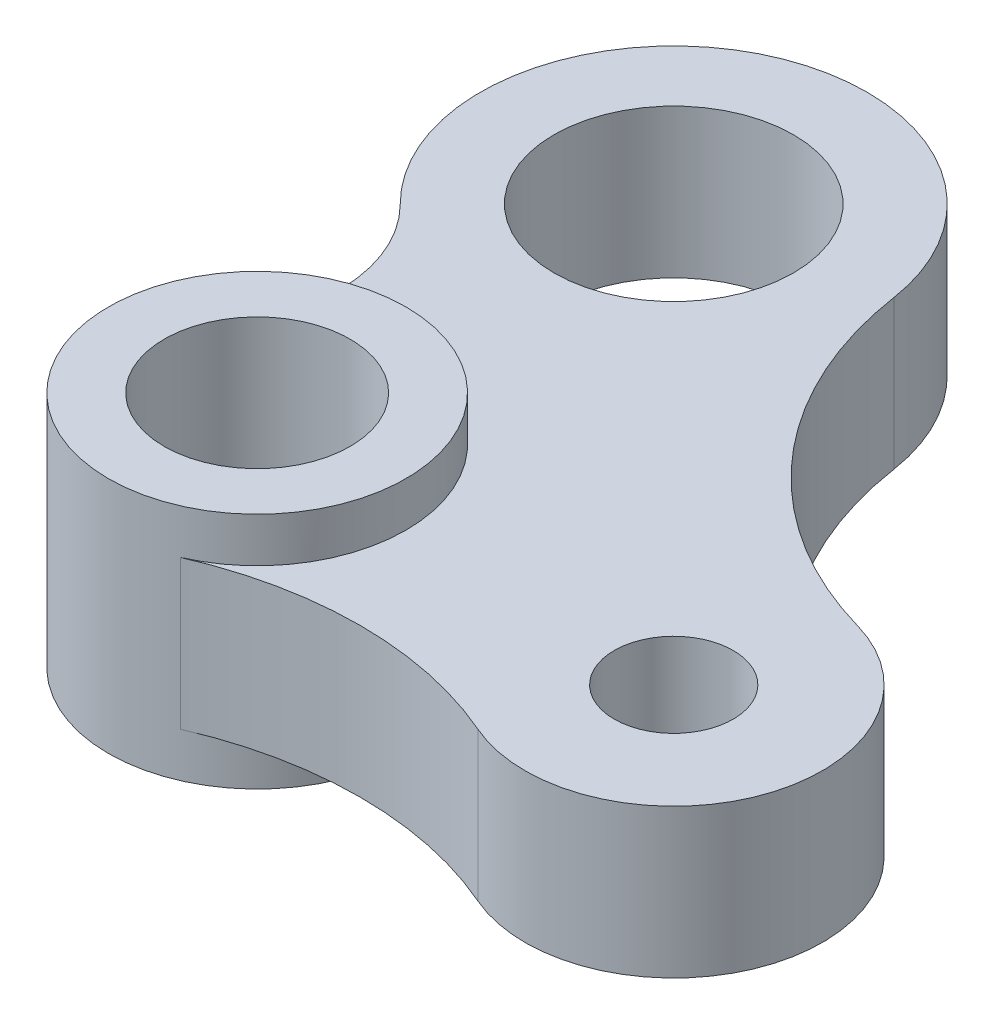
ISO-10303-21;
HEADER;
FILE_DESCRIPTION(('STEP AP214'),'2;1');
FILE_NAME('part.step','',(''),(''),'','','');
FILE_SCHEMA(('AUTOMOTIVE_DESIGN { 1 0 10303 214 1 1 1 1 }'));
ENDSEC;
DATA;
#1=APPLICATION_CONTEXT('core data for automotive mechanical design processes');
#2=APPLICATION_PROTOCOL_DEFINITION('international standard','automotive_design',2000,#1);
#3=PRODUCT_CONTEXT('',#1,'mechanical');
#4=PRODUCT('Part','Part','',(#3));
#5=PRODUCT_RELATED_PRODUCT_CATEGORY('part','',(#4));
#6=PRODUCT_DEFINITION_FORMATION('','',#4);
#7=PRODUCT_DEFINITION_CONTEXT('part definition',#1,'design');
#8=PRODUCT_DEFINITION('design','',#6,#7);
#9=PRODUCT_DEFINITION_SHAPE('','',#8);
#10=(LENGTH_UNIT() NAMED_UNIT(*) SI_UNIT(.MILLI.,.METRE.));
#11=(NAMED_UNIT(*) PLANE_ANGLE_UNIT() SI_UNIT($,.RADIAN.));
#12=(NAMED_UNIT(*) SI_UNIT($,.STERADIAN.) SOLID_ANGLE_UNIT());
#13=UNCERTAINTY_MEASURE_WITH_UNIT(LENGTH_MEASURE(1.E-05),#10,'distance_accuracy_value','');
#14=(GEOMETRIC_REPRESENTATION_CONTEXT(3) GLOBAL_UNCERTAINTY_ASSIGNED_CONTEXT((#13)) GLOBAL_UNIT_ASSIGNED_CONTEXT((#10,
#11,#12)) REPRESENTATION_CONTEXT('',''));
#15=CARTESIAN_POINT('',(0.,0.,0.));
#16=DIRECTION('',(0.,0.,1.));
#17=DIRECTION('',(1.,0.,0.));
#18=AXIS2_PLACEMENT_3D('',#15,#16,#17);
#19=CARTESIAN_POINT('',(-16.2232413121876,10.,-11.6964285714286));
#20=DIRECTION('',(0.,-1.,0.));
#21=DIRECTION('',(0.,0.,-1.));
#22=AXIS2_PLACEMENT_3D('',#19,#20,#21);
#23=CYLINDRICAL_SURFACE('',#22,10.);
#24=CARTESIAN_POINT('',(-16.2232413121876,0.,-11.6964285714286));
#25=DIRECTION('',(0.,-1.,0.));
#26=DIRECTION('',(0.,0.,1.));
#27=AXIS2_PLACEMENT_3D('',#24,#25,#26);
#28=CIRCLE('',#27,10.);
#29=CARTESIAN_POINT('',(-9.16965813297559,0.,-18.7849378881988));
#30=VERTEX_POINT('',#29);
#31=CARTESIAN_POINT('',(-8.11162065609378,0.,-5.84821428571428));
#32=VERTEX_POINT('',#31);
#33=EDGE_CURVE('E119',#30,#32,#28,.T.);
#34=ORIENTED_EDGE('',*,*,#33,.T.);
#35=DIRECTION('',(0.,-1.,0.));
#36=VECTOR('',#35,1.);
#37=CARTESIAN_POINT('',(-8.11162065609378,10.,-5.84821428571428));
#38=LINE('',#37,#36);
#39=CARTESIAN_POINT('',(-8.11162065609378,10.,-5.84821428571428));
#40=VERTEX_POINT('',#39);
#41=EDGE_CURVE('E39',#40,#32,#38,.T.);
#42=ORIENTED_EDGE('',*,*,#41,.F.);
#43=CARTESIAN_POINT('',(-16.2232413121876,10.,-11.6964285714286));
#44=DIRECTION('',(0.,-1.,0.));
#45=DIRECTION('',(0.,0.,1.));
#46=AXIS2_PLACEMENT_3D('',#43,#44,#45);
#47=CIRCLE('',#46,10.);
#48=CARTESIAN_POINT('',(-9.16965813297559,10.,-18.7849378881988));
#49=VERTEX_POINT('',#48);
#50=EDGE_CURVE('E86',#49,#40,#47,.T.);
#51=ORIENTED_EDGE('',*,*,#50,.F.);
#52=DIRECTION('',(0.,-1.,0.));
#53=VECTOR('',#52,1.);
#54=CARTESIAN_POINT('',(-9.16965813297559,10.,-18.7849378881988));
#55=LINE('',#54,#53);
#56=EDGE_CURVE('E115',#49,#30,#55,.T.);
#57=ORIENTED_EDGE('',*,*,#56,.T.);
#58=EDGE_LOOP('',(#34,#42,#51,#57));
#59=FACE_BOUND('',#58,.T.);
#60=ADVANCED_FACE('F36',(#59),#23,.F.);
#61=CARTESIAN_POINT('',(0.,10.,0.));
#62=DIRECTION('',(0.,-1.,0.));
#63=DIRECTION('',(0.,0.,-1.));
#64=AXIS2_PLACEMENT_3D('',#61,#62,#63);
#65=CYLINDRICAL_SURFACE('',#64,10.);
#66=ORIENTED_EDGE('',*,*,#41,.T.);
#67=CARTESIAN_POINT('',(0.,0.,0.));
#68=DIRECTION('',(0.,-1.,0.));
#69=DIRECTION('',(0.,0.,-1.));
#70=AXIS2_PLACEMENT_3D('',#67,#68,#69);
#71=CIRCLE('',#70,10.);
#72=CARTESIAN_POINT('',(4.,0.,9.16515138991168));
#73=VERTEX_POINT('',#72);
#74=EDGE_CURVE('E11',#32,#73,#71,.T.);
#75=ORIENTED_EDGE('',*,*,#74,.T.);
#76=DIRECTION('',(0.,-1.,0.));
#77=VECTOR('',#76,1.);
#78=CARTESIAN_POINT('',(4.00000000000001,10.,9.16515138991168));
#79=LINE('',#78,#77);
#80=CARTESIAN_POINT('',(4.00000000000001,10.,9.16515138991168));
#81=VERTEX_POINT('',#80);
#82=EDGE_CURVE('E130',#81,#73,#79,.T.);
#83=ORIENTED_EDGE('',*,*,#82,.F.);
#84=CARTESIAN_POINT('',(0.,10.,0.));
#85=DIRECTION('',(0.,1.,0.));
#86=DIRECTION('',(0.,0.,1.));
#87=AXIS2_PLACEMENT_3D('',#84,#85,#86);
#88=CIRCLE('',#87,10.);
#89=EDGE_CURVE('E140',#81,#40,#88,.T.);
#90=ORIENTED_EDGE('',*,*,#89,.T.);
#91=EDGE_LOOP('',(#66,#75,#83,#90));
#92=FACE_BOUND('',#91,.T.);
#93=CARTESIAN_POINT('',(0.,13.,0.));
#94=DIRECTION('',(0.,1.,0.));
#95=DIRECTION('',(0.,0.,1.));
#96=AXIS2_PLACEMENT_3D('',#93,#94,#95);
#97=CIRCLE('',#96,10.);
#98=CARTESIAN_POINT('',(0.,13.,10.));
#99=VERTEX_POINT('',#98);
#100=EDGE_CURVE('E148',#99,#99,#97,.T.);
#101=ORIENTED_EDGE('',*,*,#100,.F.);
#102=EDGE_LOOP('',(#101));
#103=FACE_BOUND('',#102,.T.);
#104=CARTESIAN_POINT('',(0.,-3.,0.));
#105=DIRECTION('',(0.,-1.,0.));
#106=DIRECTION('',(0.,0.,-1.));
#107=AXIS2_PLACEMENT_3D('',#104,#105,#106);
#108=CIRCLE('',#107,10.);
#109=CARTESIAN_POINT('',(0.,-3.,-10.));
#110=VERTEX_POINT('',#109);
#111=EDGE_CURVE('E149',#110,#110,#108,.T.);
#112=ORIENTED_EDGE('',*,*,#111,.F.);
#113=EDGE_LOOP('',(#112));
#114=FACE_BOUND('',#113,.T.);
#115=ADVANCED_FACE('F138',(#92,#103,#114),#65,.T.);
#116=CARTESIAN_POINT('',(14.,10.,32.0780298646909));
#117=DIRECTION('',(0.,-1.,0.));
#118=DIRECTION('',(0.,0.,-1.));
#119=AXIS2_PLACEMENT_3D('',#116,#117,#118);
#120=CYLINDRICAL_SURFACE('',#119,25.);
#121=CARTESIAN_POINT('',(14.,0.,32.0780298646909));
#122=DIRECTION('',(0.,-1.,0.));
#123=DIRECTION('',(0.,0.,1.));
#124=AXIS2_PLACEMENT_3D('',#121,#122,#123);
#125=CIRCLE('',#124,25.);
#126=CARTESIAN_POINT('',(24.,0.,9.16515138991168));
#127=VERTEX_POINT('',#126);
#128=EDGE_CURVE('E122',#73,#127,#125,.T.);
#129=ORIENTED_EDGE('',*,*,#128,.T.);
#130=DIRECTION('',(0.,-1.,0.));
#131=VECTOR('',#130,1.);
#132=CARTESIAN_POINT('',(24.,10.,9.16515138991168));
#133=LINE('',#132,#131);
#134=CARTESIAN_POINT('',(24.,10.,9.16515138991168));
#135=VERTEX_POINT('',#134);
#136=EDGE_CURVE('E110',#135,#127,#133,.T.);
#137=ORIENTED_EDGE('',*,*,#136,.F.);
#138=CARTESIAN_POINT('',(14.,10.,32.0780298646909));
#139=DIRECTION('',(0.,-1.,0.));
#140=DIRECTION('',(0.,0.,1.));
#141=AXIS2_PLACEMENT_3D('',#138,#139,#140);
#142=CIRCLE('',#141,25.);
#143=EDGE_CURVE('E101',#81,#135,#142,.T.);
#144=ORIENTED_EDGE('',*,*,#143,.F.);
#145=ORIENTED_EDGE('',*,*,#82,.T.);
#146=EDGE_LOOP('',(#129,#137,#144,#145));
#147=FACE_BOUND('',#146,.T.);
#148=ADVANCED_FACE('F147',(#147),#120,.F.);
#149=CARTESIAN_POINT('',(28.,10.,0.));
#150=DIRECTION('',(0.,-1.,0.));
#151=DIRECTION('',(0.,0.,-1.));
#152=AXIS2_PLACEMENT_3D('',#149,#150,#151);
#153=CYLINDRICAL_SURFACE('',#152,10.);
#154=CARTESIAN_POINT('',(28.,0.,0.));
#155=DIRECTION('',(0.,1.,0.));
#156=DIRECTION('',(0.,0.,1.));
#157=AXIS2_PLACEMENT_3D('',#154,#155,#156);
#158=CIRCLE('',#157,10.);
#159=CARTESIAN_POINT('',(30.7358307208833,0.,-9.61848378210782));
#160=VERTEX_POINT('',#159);
#161=EDGE_CURVE('E109',#127,#160,#158,.T.);
#162=ORIENTED_EDGE('',*,*,#161,.T.);
#163=DIRECTION('',(0.,-1.,0.));
#164=VECTOR('',#163,1.);
#165=CARTESIAN_POINT('',(30.7358307208833,10.,-9.61848378210782));
#166=LINE('',#165,#164);
#167=CARTESIAN_POINT('',(30.7358307208833,10.,-9.61848378210782));
#168=VERTEX_POINT('',#167);
#169=EDGE_CURVE('E106',#168,#160,#166,.T.);
#170=ORIENTED_EDGE('',*,*,#169,.F.);
#171=CARTESIAN_POINT('',(28.,10.,0.));
#172=DIRECTION('',(0.,1.,0.));
#173=DIRECTION('',(0.,0.,1.));
#174=AXIS2_PLACEMENT_3D('',#171,#172,#173);
#175=CIRCLE('',#174,10.);
#176=EDGE_CURVE('E94',#135,#168,#175,.T.);
#177=ORIENTED_EDGE('',*,*,#176,.F.);
#178=ORIENTED_EDGE('',*,*,#136,.T.);
#179=EDGE_LOOP('',(#162,#170,#177,#178));
#180=FACE_BOUND('',#179,.T.);
#181=ADVANCED_FACE('F107',(#180),#153,.T.);
#182=CARTESIAN_POINT('',(37.5754075230916,10.,-33.6646932373773));
#183=DIRECTION('',(0.,-1.,0.));
#184=DIRECTION('',(0.,0.,-1.));
#185=AXIS2_PLACEMENT_3D('',#182,#183,#184);
#186=CYLINDRICAL_SURFACE('',#185,25.);
#187=CARTESIAN_POINT('',(37.5754075230916,0.,-33.6646932373773));
#188=DIRECTION('',(0.,-1.,0.));
#189=DIRECTION('',(0.,0.,1.));
#190=AXIS2_PLACEMENT_3D('',#187,#188,#189);
#191=CIRCLE('',#190,25.);
#192=CARTESIAN_POINT('',(12.8547446789524,0.,-29.9379213706817));
#193=VERTEX_POINT('',#192);
#194=EDGE_CURVE('E74',#160,#193,#191,.T.);
#195=ORIENTED_EDGE('',*,*,#194,.T.);
#196=DIRECTION('',(0.,-1.,0.));
#197=VECTOR('',#196,1.);
#198=CARTESIAN_POINT('',(12.8547446789524,10.,-29.9379213706817));
#199=LINE('',#198,#197);
#200=CARTESIAN_POINT('',(12.8547446789524,10.,-29.9379213706817));
#201=VERTEX_POINT('',#200);
#202=EDGE_CURVE('E111',#201,#193,#199,.T.);
#203=ORIENTED_EDGE('',*,*,#202,.F.);
#204=CARTESIAN_POINT('',(37.5754075230916,10.,-33.6646932373773));
#205=DIRECTION('',(0.,-1.,0.));
#206=DIRECTION('',(0.,0.,1.));
#207=AXIS2_PLACEMENT_3D('',#204,#205,#206);
#208=CIRCLE('',#207,25.);
#209=EDGE_CURVE('E99',#168,#201,#208,.T.);
#210=ORIENTED_EDGE('',*,*,#209,.F.);
#211=ORIENTED_EDGE('',*,*,#169,.T.);
#212=EDGE_LOOP('',(#195,#203,#210,#211));
#213=FACE_BOUND('',#212,.T.);
#214=ADVANCED_FACE('F113',(#213),#186,.F.);
#215=CARTESIAN_POINT('',(0.,10.,-28.));
#216=DIRECTION('',(0.,-1.,0.));
#217=DIRECTION('',(0.,0.,-1.));
#218=AXIS2_PLACEMENT_3D('',#215,#216,#217);
#219=CYLINDRICAL_SURFACE('',#218,13.);
#220=CARTESIAN_POINT('',(0.,0.,-28.));
#221=DIRECTION('',(0.,1.,0.));
#222=DIRECTION('',(0.,0.,1.));
#223=AXIS2_PLACEMENT_3D('',#220,#221,#222);
#224=CIRCLE('',#223,13.);
#225=EDGE_CURVE('E80',#193,#30,#224,.T.);
#226=ORIENTED_EDGE('',*,*,#225,.T.);
#227=ORIENTED_EDGE('',*,*,#56,.F.);
#228=CARTESIAN_POINT('',(0.,10.,-28.));
#229=DIRECTION('',(0.,1.,0.));
#230=DIRECTION('',(0.,0.,1.));
#231=AXIS2_PLACEMENT_3D('',#228,#229,#230);
#232=CIRCLE('',#231,13.);
#233=EDGE_CURVE('E53',#201,#49,#232,.T.);
#234=ORIENTED_EDGE('',*,*,#233,.F.);
#235=ORIENTED_EDGE('',*,*,#202,.T.);
#236=EDGE_LOOP('',(#226,#227,#234,#235));
#237=FACE_BOUND('',#236,.T.);
#238=ADVANCED_FACE('F173',(#237),#219,.T.);
#239=CARTESIAN_POINT('',(-8.11162065609378,10.,-19.8482142857143));
#240=DIRECTION('',(0.,1.,0.));
#241=DIRECTION('',(0.,0.,1.));
#242=AXIS2_PLACEMENT_3D('',#239,#240,#241);
#243=PLANE('',#242);
#244=ORIENTED_EDGE('',*,*,#89,.F.);
#245=ORIENTED_EDGE('',*,*,#143,.T.);
#246=ORIENTED_EDGE('',*,*,#176,.T.);
#247=ORIENTED_EDGE('',*,*,#209,.T.);
#248=ORIENTED_EDGE('',*,*,#233,.T.);
#249=ORIENTED_EDGE('',*,*,#50,.T.);
#250=EDGE_LOOP('',(#244,#245,#246,#247,#248,#249));
#251=FACE_BOUND('',#250,.T.);
#252=CARTESIAN_POINT('',(0.,10.,-28.));
#253=DIRECTION('',(0.,1.,0.));
#254=DIRECTION('',(0.,0.,1.));
#255=AXIS2_PLACEMENT_3D('',#252,#253,#254);
#256=CIRCLE('',#255,8.05);
#257=CARTESIAN_POINT('',(0.,10.,-19.95));
#258=VERTEX_POINT('',#257);
#259=EDGE_CURVE('E160',#258,#258,#256,.T.);
#260=ORIENTED_EDGE('',*,*,#259,.F.);
#261=EDGE_LOOP('',(#260));
#262=FACE_BOUND('',#261,.T.);
#263=CARTESIAN_POINT('',(28.,10.,0.));
#264=DIRECTION('',(0.,1.,0.));
#265=DIRECTION('',(0.,0.,1.));
#266=AXIS2_PLACEMENT_3D('',#263,#264,#265);
#267=CIRCLE('',#266,4.);
#268=CARTESIAN_POINT('',(28.,10.,4.));
#269=VERTEX_POINT('',#268);
#270=EDGE_CURVE('E152',#269,#269,#267,.T.);
#271=ORIENTED_EDGE('',*,*,#270,.F.);
#272=EDGE_LOOP('',(#271));
#273=FACE_BOUND('',#272,.T.);
#274=ADVANCED_FACE('F96',(#251,#262,#273),#243,.T.);
#275=CARTESIAN_POINT('',(-8.11162065609378,0.,-19.8482142857143));
#276=DIRECTION('',(0.,1.,0.));
#277=DIRECTION('',(0.,0.,1.));
#278=AXIS2_PLACEMENT_3D('',#275,#276,#277);
#279=PLANE('',#278);
#280=ORIENTED_EDGE('',*,*,#74,.F.);
#281=ORIENTED_EDGE('',*,*,#33,.F.);
#282=ORIENTED_EDGE('',*,*,#225,.F.);
#283=ORIENTED_EDGE('',*,*,#194,.F.);
#284=ORIENTED_EDGE('',*,*,#161,.F.);
#285=ORIENTED_EDGE('',*,*,#128,.F.);
#286=EDGE_LOOP('',(#280,#281,#282,#283,#284,#285));
#287=FACE_BOUND('',#286,.T.);
#288=CARTESIAN_POINT('',(0.,0.,-28.));
#289=DIRECTION('',(0.,1.,0.));
#290=DIRECTION('',(0.,0.,1.));
#291=AXIS2_PLACEMENT_3D('',#288,#289,#290);
#292=CIRCLE('',#291,8.05);
#293=CARTESIAN_POINT('',(0.,0.,-19.95));
#294=VERTEX_POINT('',#293);
#295=EDGE_CURVE('E123',#294,#294,#292,.T.);
#296=ORIENTED_EDGE('',*,*,#295,.T.);
#297=EDGE_LOOP('',(#296));
#298=FACE_BOUND('',#297,.T.);
#299=CARTESIAN_POINT('',(28.,0.,0.));
#300=DIRECTION('',(0.,1.,0.));
#301=DIRECTION('',(0.,0.,1.));
#302=AXIS2_PLACEMENT_3D('',#299,#300,#301);
#303=CIRCLE('',#302,4.);
#304=CARTESIAN_POINT('',(28.,0.,4.));
#305=VERTEX_POINT('',#304);
#306=EDGE_CURVE('E163',#305,#305,#303,.T.);
#307=ORIENTED_EDGE('',*,*,#306,.T.);
#308=EDGE_LOOP('',(#307));
#309=FACE_BOUND('',#308,.T.);
#310=ADVANCED_FACE('F144',(#287,#298,#309),#279,.F.);
#311=CARTESIAN_POINT('',(28.,0.,0.));
#312=DIRECTION('',(0.,1.,0.));
#313=DIRECTION('',(0.,0.,1.));
#314=AXIS2_PLACEMENT_3D('',#311,#312,#313);
#315=CYLINDRICAL_SURFACE('',#314,4.);
#316=ORIENTED_EDGE('',*,*,#306,.F.);
#317=EDGE_LOOP('',(#316));
#318=FACE_BOUND('',#317,.T.);
#319=ORIENTED_EDGE('',*,*,#270,.T.);
#320=EDGE_LOOP('',(#319));
#321=FACE_BOUND('',#320,.T.);
#322=ADVANCED_FACE('F170',(#318,#321),#315,.F.);
#323=CARTESIAN_POINT('',(0.,0.,-28.));
#324=DIRECTION('',(0.,1.,0.));
#325=DIRECTION('',(0.,0.,1.));
#326=AXIS2_PLACEMENT_3D('',#323,#324,#325);
#327=CYLINDRICAL_SURFACE('',#326,8.05);
#328=ORIENTED_EDGE('',*,*,#295,.F.);
#329=EDGE_LOOP('',(#328));
#330=FACE_BOUND('',#329,.T.);
#331=ORIENTED_EDGE('',*,*,#259,.T.);
#332=EDGE_LOOP('',(#331));
#333=FACE_BOUND('',#332,.T.);
#334=ADVANCED_FACE('F212',(#330,#333),#327,.F.);
#335=CARTESIAN_POINT('',(0.,13.,0.));
#336=DIRECTION('',(0.,1.,0.));
#337=DIRECTION('',(0.,0.,1.));
#338=AXIS2_PLACEMENT_3D('',#335,#336,#337);
#339=PLANE('',#338);
#340=CARTESIAN_POINT('',(0.,13.,0.));
#341=DIRECTION('',(0.,1.,0.));
#342=DIRECTION('',(0.,0.,1.));
#343=AXIS2_PLACEMENT_3D('',#340,#341,#342);
#344=CIRCLE('',#343,6.25);
#345=CARTESIAN_POINT('',(0.,13.,6.25));
#346=VERTEX_POINT('',#345);
#347=EDGE_CURVE('E279',#346,#346,#344,.T.);
#348=ORIENTED_EDGE('',*,*,#347,.F.);
#349=EDGE_LOOP('',(#348));
#350=FACE_BOUND('',#349,.T.);
#351=ORIENTED_EDGE('',*,*,#100,.T.);
#352=EDGE_LOOP('',(#351));
#353=FACE_BOUND('',#352,.T.);
#354=ADVANCED_FACE('F221',(#350,#353),#339,.T.);
#355=CARTESIAN_POINT('',(0.,-3.,0.));
#356=DIRECTION('',(0.,-1.,0.));
#357=DIRECTION('',(0.,0.,-1.));
#358=AXIS2_PLACEMENT_3D('',#355,#356,#357);
#359=PLANE('',#358);
#360=CARTESIAN_POINT('',(0.,-3.,0.));
#361=DIRECTION('',(0.,1.,0.));
#362=DIRECTION('',(0.,0.,1.));
#363=AXIS2_PLACEMENT_3D('',#360,#361,#362);
#364=CIRCLE('',#363,6.25);
#365=CARTESIAN_POINT('',(0.,-3.,6.25));
#366=VERTEX_POINT('',#365);
#367=EDGE_CURVE('E155',#366,#366,#364,.T.);
#368=ORIENTED_EDGE('',*,*,#367,.T.);
#369=EDGE_LOOP('',(#368));
#370=FACE_BOUND('',#369,.T.);
#371=ORIENTED_EDGE('',*,*,#111,.T.);
#372=EDGE_LOOP('',(#371));
#373=FACE_BOUND('',#372,.T.);
#374=ADVANCED_FACE('F251',(#370,#373),#359,.T.);
#375=CARTESIAN_POINT('',(0.,-3.,0.));
#376=DIRECTION('',(0.,1.,0.));
#377=DIRECTION('',(0.,0.,1.));
#378=AXIS2_PLACEMENT_3D('',#375,#376,#377);
#379=CYLINDRICAL_SURFACE('',#378,6.25);
#380=ORIENTED_EDGE('',*,*,#367,.F.);
#381=EDGE_LOOP('',(#380));
#382=FACE_BOUND('',#381,.T.);
#383=ORIENTED_EDGE('',*,*,#347,.T.);
#384=EDGE_LOOP('',(#383));
#385=FACE_BOUND('',#384,.T.);
#386=ADVANCED_FACE('F260',(#382,#385),#379,.F.);
#387=CLOSED_SHELL('',(#60,#115,#148,#181,#214,#238,#274,#310,#322,#334,#354,#374,#386));
#388=MANIFOLD_SOLID_BREP('B2',#387);
#389=ADVANCED_BREP_SHAPE_REPRESENTATION('',(#18,#388),#14);
#390=SHAPE_DEFINITION_REPRESENTATION(#9,#389);
ENDSEC;
END-ISO-10303-21;
